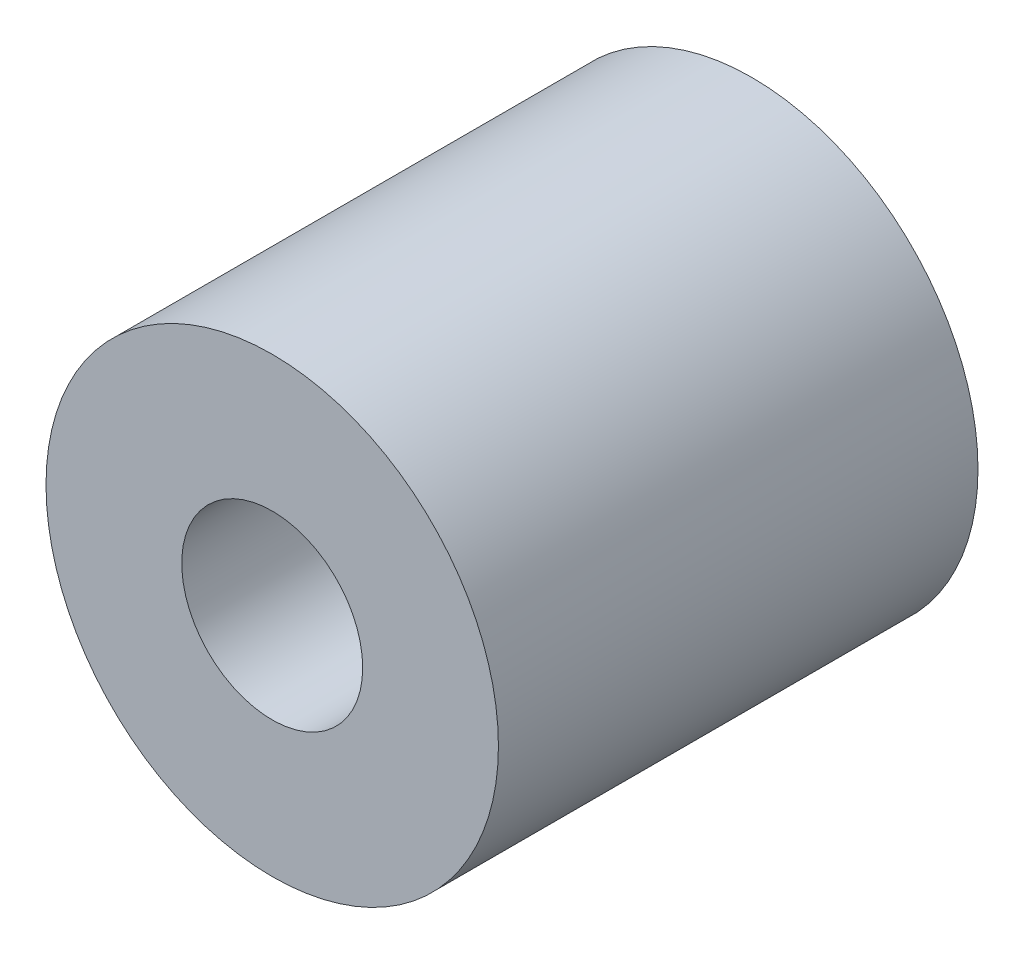
ISO-10303-21;
HEADER;
FILE_DESCRIPTION(('STEP AP214'),'2;1');
FILE_NAME('part.step','',(''),(''),'','','');
FILE_SCHEMA(('AUTOMOTIVE_DESIGN { 1 0 10303 214 1 1 1 1 }'));
ENDSEC;
DATA;
#1=APPLICATION_CONTEXT('core data for automotive mechanical design processes');
#2=APPLICATION_PROTOCOL_DEFINITION('international standard','automotive_design',2000,#1);
#3=PRODUCT_CONTEXT('',#1,'mechanical');
#4=PRODUCT('Part','Part','',(#3));
#5=PRODUCT_RELATED_PRODUCT_CATEGORY('part','',(#4));
#6=PRODUCT_DEFINITION_FORMATION('','',#4);
#7=PRODUCT_DEFINITION_CONTEXT('part definition',#1,'design');
#8=PRODUCT_DEFINITION('design','',#6,#7);
#9=PRODUCT_DEFINITION_SHAPE('','',#8);
#10=(LENGTH_UNIT() NAMED_UNIT(*) SI_UNIT(.MILLI.,.METRE.));
#11=(NAMED_UNIT(*) PLANE_ANGLE_UNIT() SI_UNIT($,.RADIAN.));
#12=(NAMED_UNIT(*) SI_UNIT($,.STERADIAN.) SOLID_ANGLE_UNIT());
#13=UNCERTAINTY_MEASURE_WITH_UNIT(LENGTH_MEASURE(1.E-05),#10,'distance_accuracy_value','');
#14=(GEOMETRIC_REPRESENTATION_CONTEXT(3) GLOBAL_UNCERTAINTY_ASSIGNED_CONTEXT((#13)) GLOBAL_UNIT_ASSIGNED_CONTEXT((#10,
#11,#12)) REPRESENTATION_CONTEXT('',''));
#15=CARTESIAN_POINT('',(0.,0.,0.));
#16=DIRECTION('',(0.,0.,1.));
#17=DIRECTION('',(1.,0.,0.));
#18=AXIS2_PLACEMENT_3D('',#15,#16,#17);
#19=CARTESIAN_POINT('',(0.,0.,15.9));
#20=DIRECTION('',(0.,0.,-1.));
#21=DIRECTION('',(-1.,0.,0.));
#22=AXIS2_PLACEMENT_3D('',#19,#20,#21);
#23=CYLINDRICAL_SURFACE('',#22,7.5);
#24=CARTESIAN_POINT('',(0.,0.,15.9));
#25=DIRECTION('',(0.,0.,1.));
#26=DIRECTION('',(1.,0.,0.));
#27=AXIS2_PLACEMENT_3D('',#24,#25,#26);
#28=CIRCLE('',#27,7.5);
#29=CARTESIAN_POINT('',(7.5,0.,15.9));
#30=VERTEX_POINT('',#29);
#31=EDGE_CURVE('E10',#30,#30,#28,.T.);
#32=ORIENTED_EDGE('',*,*,#31,.F.);
#33=EDGE_LOOP('',(#32));
#34=FACE_BOUND('',#33,.T.);
#35=CARTESIAN_POINT('',(0.,0.,0.));
#36=DIRECTION('',(0.,0.,1.));
#37=DIRECTION('',(1.,0.,0.));
#38=AXIS2_PLACEMENT_3D('',#35,#36,#37);
#39=CIRCLE('',#38,7.5);
#40=CARTESIAN_POINT('',(7.5,0.,0.));
#41=VERTEX_POINT('',#40);
#42=EDGE_CURVE('E33',#41,#41,#39,.T.);
#43=ORIENTED_EDGE('',*,*,#42,.T.);
#44=EDGE_LOOP('',(#43));
#45=FACE_BOUND('',#44,.T.);
#46=ADVANCED_FACE('F30',(#34,#45),#23,.T.);
#47=CARTESIAN_POINT('',(0.,0.,15.9));
#48=DIRECTION('',(0.,0.,1.));
#49=DIRECTION('',(1.,0.,0.));
#50=AXIS2_PLACEMENT_3D('',#47,#48,#49);
#51=PLANE('',#50);
#52=CARTESIAN_POINT('',(0.,0.,15.9));
#53=DIRECTION('',(0.,0.,1.));
#54=DIRECTION('',(1.,0.,0.));
#55=AXIS2_PLACEMENT_3D('',#52,#53,#54);
#56=CIRCLE('',#55,3.);
#57=CARTESIAN_POINT('',(3.,0.,15.9));
#58=VERTEX_POINT('',#57);
#59=EDGE_CURVE('E42',#58,#58,#56,.T.);
#60=ORIENTED_EDGE('',*,*,#59,.F.);
#61=EDGE_LOOP('',(#60));
#62=FACE_BOUND('',#61,.T.);
#63=ORIENTED_EDGE('',*,*,#31,.T.);
#64=EDGE_LOOP('',(#63));
#65=FACE_BOUND('',#64,.T.);
#66=ADVANCED_FACE('F67',(#62,#65),#51,.T.);
#67=CARTESIAN_POINT('',(0.,0.,0.));
#68=DIRECTION('',(0.,0.,1.));
#69=DIRECTION('',(1.,0.,0.));
#70=AXIS2_PLACEMENT_3D('',#67,#68,#69);
#71=PLANE('',#70);
#72=CARTESIAN_POINT('',(0.,0.,0.));
#73=DIRECTION('',(0.,0.,-1.));
#74=DIRECTION('',(-1.,0.,0.));
#75=AXIS2_PLACEMENT_3D('',#72,#73,#74);
#76=CIRCLE('',#75,3.);
#77=CARTESIAN_POINT('',(-3.,0.,0.));
#78=VERTEX_POINT('',#77);
#79=EDGE_CURVE('E48',#78,#78,#76,.T.);
#80=ORIENTED_EDGE('',*,*,#79,.F.);
#81=EDGE_LOOP('',(#80));
#82=FACE_BOUND('',#81,.T.);
#83=ORIENTED_EDGE('',*,*,#42,.F.);
#84=EDGE_LOOP('',(#83));
#85=FACE_BOUND('',#84,.T.);
#86=ADVANCED_FACE('F63',(#82,#85),#71,.F.);
#87=CARTESIAN_POINT('',(0.,0.,8.4));
#88=DIRECTION('',(0.,0.,1.));
#89=DIRECTION('',(1.,0.,0.));
#90=AXIS2_PLACEMENT_3D('',#87,#88,#89);
#91=CYLINDRICAL_SURFACE('',#90,3.);
#92=CARTESIAN_POINT('',(0.,0.,8.4));
#93=DIRECTION('',(0.,0.,1.));
#94=DIRECTION('',(1.,0.,0.));
#95=AXIS2_PLACEMENT_3D('',#92,#93,#94);
#96=CIRCLE('',#95,3.);
#97=CARTESIAN_POINT('',(3.,0.,8.4));
#98=VERTEX_POINT('',#97);
#99=EDGE_CURVE('E40',#98,#98,#96,.T.);
#100=ORIENTED_EDGE('',*,*,#99,.F.);
#101=EDGE_LOOP('',(#100));
#102=FACE_BOUND('',#101,.T.);
#103=ORIENTED_EDGE('',*,*,#59,.T.);
#104=EDGE_LOOP('',(#103));
#105=FACE_BOUND('',#104,.T.);
#106=ADVANCED_FACE('F66',(#102,#105),#91,.F.);
#107=CARTESIAN_POINT('',(0.,0.,8.4));
#108=DIRECTION('',(0.,0.,1.));
#109=DIRECTION('',(1.,0.,0.));
#110=AXIS2_PLACEMENT_3D('',#107,#108,#109);
#111=PLANE('',#110);
#112=ORIENTED_EDGE('',*,*,#99,.T.);
#113=EDGE_LOOP('',(#112));
#114=FACE_BOUND('',#113,.T.);
#115=ADVANCED_FACE('F59',(#114),#111,.T.);
#116=CARTESIAN_POINT('',(0.,0.,7.5));
#117=DIRECTION('',(0.,0.,-1.));
#118=DIRECTION('',(-1.,0.,0.));
#119=AXIS2_PLACEMENT_3D('',#116,#117,#118);
#120=CYLINDRICAL_SURFACE('',#119,3.);
#121=CARTESIAN_POINT('',(0.,0.,7.5));
#122=DIRECTION('',(0.,0.,-1.));
#123=DIRECTION('',(-1.,0.,0.));
#124=AXIS2_PLACEMENT_3D('',#121,#122,#123);
#125=CIRCLE('',#124,3.);
#126=CARTESIAN_POINT('',(-3.,0.,7.5));
#127=VERTEX_POINT('',#126);
#128=EDGE_CURVE('E45',#127,#127,#125,.T.);
#129=ORIENTED_EDGE('',*,*,#128,.F.);
#130=EDGE_LOOP('',(#129));
#131=FACE_BOUND('',#130,.T.);
#132=ORIENTED_EDGE('',*,*,#79,.T.);
#133=EDGE_LOOP('',(#132));
#134=FACE_BOUND('',#133,.T.);
#135=ADVANCED_FACE('F56',(#131,#134),#120,.F.);
#136=CARTESIAN_POINT('',(0.,0.,7.5));
#137=DIRECTION('',(0.,0.,-1.));
#138=DIRECTION('',(-1.,0.,0.));
#139=AXIS2_PLACEMENT_3D('',#136,#137,#138);
#140=PLANE('',#139);
#141=ORIENTED_EDGE('',*,*,#128,.T.);
#142=EDGE_LOOP('',(#141));
#143=FACE_BOUND('',#142,.T.);
#144=ADVANCED_FACE('F54',(#143),#140,.T.);
#145=CLOSED_SHELL('',(#46,#66,#86,#106,#115,#135,#144));
#146=MANIFOLD_SOLID_BREP('B2',#145);
#147=ADVANCED_BREP_SHAPE_REPRESENTATION('',(#18,#146),#14);
#148=SHAPE_DEFINITION_REPRESENTATION(#9,#147);
ENDSEC;
END-ISO-10303-21;
